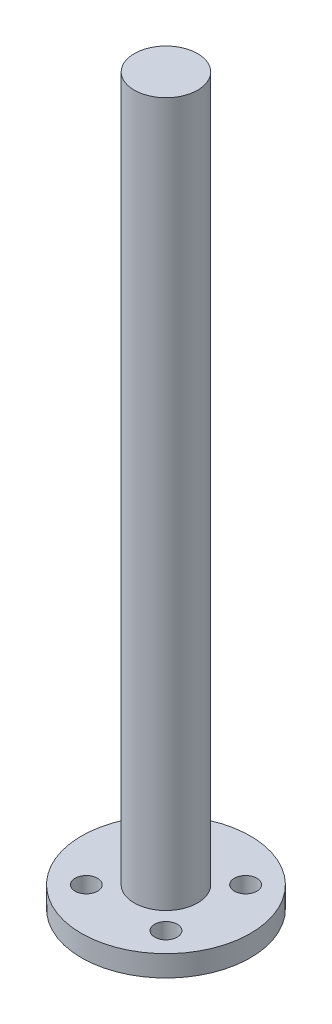
ISO-10303-21;
HEADER;
FILE_DESCRIPTION(('STEP AP214'),'2;1');
FILE_NAME('part.step','',(''),(''),'','','');
FILE_SCHEMA(('AUTOMOTIVE_DESIGN { 1 0 10303 214 1 1 1 1 }'));
ENDSEC;
DATA;
#1=APPLICATION_CONTEXT('core data for automotive mechanical design processes');
#2=APPLICATION_PROTOCOL_DEFINITION('international standard','automotive_design',2000,#1);
#3=PRODUCT_CONTEXT('',#1,'mechanical');
#4=PRODUCT('Part','Part','',(#3));
#5=PRODUCT_RELATED_PRODUCT_CATEGORY('part','',(#4));
#6=PRODUCT_DEFINITION_FORMATION('','',#4);
#7=PRODUCT_DEFINITION_CONTEXT('part definition',#1,'design');
#8=PRODUCT_DEFINITION('design','',#6,#7);
#9=PRODUCT_DEFINITION_SHAPE('','',#8);
#10=(LENGTH_UNIT() NAMED_UNIT(*) SI_UNIT(.MILLI.,.METRE.));
#11=(NAMED_UNIT(*) PLANE_ANGLE_UNIT() SI_UNIT($,.RADIAN.));
#12=(NAMED_UNIT(*) SI_UNIT($,.STERADIAN.) SOLID_ANGLE_UNIT());
#13=UNCERTAINTY_MEASURE_WITH_UNIT(LENGTH_MEASURE(1.E-05),#10,'distance_accuracy_value','');
#14=(GEOMETRIC_REPRESENTATION_CONTEXT(3) GLOBAL_UNCERTAINTY_ASSIGNED_CONTEXT((#13)) GLOBAL_UNIT_ASSIGNED_CONTEXT((#10,
#11,#12)) REPRESENTATION_CONTEXT('',''));
#15=CARTESIAN_POINT('',(0.,0.,0.));
#16=DIRECTION('',(0.,0.,1.));
#17=DIRECTION('',(1.,0.,0.));
#18=AXIS2_PLACEMENT_3D('',#15,#16,#17);
#19=CARTESIAN_POINT('',(0.,-3.,0.));
#20=DIRECTION('',(0.,1.,0.));
#21=DIRECTION('',(0.,0.,1.));
#22=AXIS2_PLACEMENT_3D('',#19,#20,#21);
#23=CYLINDRICAL_SURFACE('',#22,12.);
#24=CARTESIAN_POINT('',(0.,-3.,0.));
#25=DIRECTION('',(0.,1.,0.));
#26=DIRECTION('',(0.,0.,1.));
#27=AXIS2_PLACEMENT_3D('',#24,#25,#26);
#28=CIRCLE('',#27,12.);
#29=CARTESIAN_POINT('',(0.,-3.,12.));
#30=VERTEX_POINT('',#29);
#31=EDGE_CURVE('E10',#30,#30,#28,.T.);
#32=ORIENTED_EDGE('',*,*,#31,.T.);
#33=EDGE_LOOP('',(#32));
#34=FACE_BOUND('',#33,.T.);
#35=CARTESIAN_POINT('',(0.,0.,0.));
#36=DIRECTION('',(0.,1.,0.));
#37=DIRECTION('',(0.,0.,1.));
#38=AXIS2_PLACEMENT_3D('',#35,#36,#37);
#39=CIRCLE('',#38,12.);
#40=CARTESIAN_POINT('',(0.,0.,12.));
#41=VERTEX_POINT('',#40);
#42=EDGE_CURVE('E41',#41,#41,#39,.T.);
#43=ORIENTED_EDGE('',*,*,#42,.F.);
#44=EDGE_LOOP('',(#43));
#45=FACE_BOUND('',#44,.T.);
#46=ADVANCED_FACE('F38',(#34,#45),#23,.T.);
#47=CARTESIAN_POINT('',(0.,-3.,0.));
#48=DIRECTION('',(0.,1.,0.));
#49=DIRECTION('',(0.,0.,1.));
#50=AXIS2_PLACEMENT_3D('',#47,#48,#49);
#51=PLANE('',#50);
#52=CARTESIAN_POINT('',(5.65685424949245,-3.,-5.65685424949231));
#53=DIRECTION('',(0.,1.,0.));
#54=DIRECTION('',(0.,0.,1.));
#55=AXIS2_PLACEMENT_3D('',#52,#53,#54);
#56=CIRCLE('',#55,1.6);
#57=CARTESIAN_POINT('',(5.65685424949245,-3.,-4.05685424949231));
#58=VERTEX_POINT('',#57);
#59=EDGE_CURVE('E56',#58,#58,#56,.T.);
#60=ORIENTED_EDGE('',*,*,#59,.T.);
#61=EDGE_LOOP('',(#60));
#62=FACE_BOUND('',#61,.T.);
#63=CARTESIAN_POINT('',(-5.65685424949233,-3.,-5.65685424949243));
#64=DIRECTION('',(0.,1.,0.));
#65=DIRECTION('',(0.,0.,1.));
#66=AXIS2_PLACEMENT_3D('',#63,#64,#65);
#67=CIRCLE('',#66,1.6);
#68=CARTESIAN_POINT('',(-5.65685424949233,-3.,-4.05685424949243));
#69=VERTEX_POINT('',#68);
#70=EDGE_CURVE('E63',#69,#69,#67,.T.);
#71=ORIENTED_EDGE('',*,*,#70,.T.);
#72=EDGE_LOOP('',(#71));
#73=FACE_BOUND('',#72,.T.);
#74=CARTESIAN_POINT('',(-5.65685424949241,-3.,5.65685424949235));
#75=DIRECTION('',(0.,1.,0.));
#76=DIRECTION('',(0.,0.,1.));
#77=AXIS2_PLACEMENT_3D('',#74,#75,#76);
#78=CIRCLE('',#77,1.6);
#79=CARTESIAN_POINT('',(-5.65685424949241,-3.,7.25685424949235));
#80=VERTEX_POINT('',#79);
#81=EDGE_CURVE('E69',#80,#80,#78,.T.);
#82=ORIENTED_EDGE('',*,*,#81,.T.);
#83=EDGE_LOOP('',(#82));
#84=FACE_BOUND('',#83,.T.);
#85=CARTESIAN_POINT('',(5.65685424949237,-3.,5.65685424949239));
#86=DIRECTION('',(0.,1.,0.));
#87=DIRECTION('',(0.,0.,1.));
#88=AXIS2_PLACEMENT_3D('',#85,#86,#87);
#89=CIRCLE('',#88,1.6);
#90=CARTESIAN_POINT('',(5.65685424949237,-3.,7.25685424949239));
#91=VERTEX_POINT('',#90);
#92=EDGE_CURVE('E48',#91,#91,#89,.T.);
#93=ORIENTED_EDGE('',*,*,#92,.T.);
#94=EDGE_LOOP('',(#93));
#95=FACE_BOUND('',#94,.T.);
#96=ORIENTED_EDGE('',*,*,#31,.F.);
#97=EDGE_LOOP('',(#96));
#98=FACE_BOUND('',#97,.T.);
#99=ADVANCED_FACE('F93',(#62,#73,#84,#95,#98),#51,.F.);
#100=CARTESIAN_POINT('',(0.,0.,0.));
#101=DIRECTION('',(0.,1.,0.));
#102=DIRECTION('',(0.,0.,1.));
#103=AXIS2_PLACEMENT_3D('',#100,#101,#102);
#104=PLANE('',#103);
#105=CARTESIAN_POINT('',(0.,0.,0.));
#106=DIRECTION('',(0.,1.,0.));
#107=DIRECTION('',(0.,0.,1.));
#108=AXIS2_PLACEMENT_3D('',#105,#106,#107);
#109=CIRCLE('',#108,4.5);
#110=CARTESIAN_POINT('',(0.,0.,4.5));
#111=VERTEX_POINT('',#110);
#112=EDGE_CURVE('E74',#111,#111,#109,.T.);
#113=ORIENTED_EDGE('',*,*,#112,.F.);
#114=EDGE_LOOP('',(#113));
#115=FACE_BOUND('',#114,.T.);
#116=CARTESIAN_POINT('',(5.65685424949245,0.,-5.65685424949231));
#117=DIRECTION('',(0.,1.,0.));
#118=DIRECTION('',(0.,0.,1.));
#119=AXIS2_PLACEMENT_3D('',#116,#117,#118);
#120=CIRCLE('',#119,1.6);
#121=CARTESIAN_POINT('',(5.65685424949245,0.,-4.05685424949231));
#122=VERTEX_POINT('',#121);
#123=EDGE_CURVE('E59',#122,#122,#120,.T.);
#124=ORIENTED_EDGE('',*,*,#123,.F.);
#125=EDGE_LOOP('',(#124));
#126=FACE_BOUND('',#125,.T.);
#127=CARTESIAN_POINT('',(-5.65685424949233,0.,-5.65685424949243));
#128=DIRECTION('',(0.,1.,0.));
#129=DIRECTION('',(0.,0.,1.));
#130=AXIS2_PLACEMENT_3D('',#127,#128,#129);
#131=CIRCLE('',#130,1.6);
#132=CARTESIAN_POINT('',(-5.65685424949233,0.,-4.05685424949243));
#133=VERTEX_POINT('',#132);
#134=EDGE_CURVE('E66',#133,#133,#131,.T.);
#135=ORIENTED_EDGE('',*,*,#134,.F.);
#136=EDGE_LOOP('',(#135));
#137=FACE_BOUND('',#136,.T.);
#138=CARTESIAN_POINT('',(-5.65685424949241,0.,5.65685424949235));
#139=DIRECTION('',(0.,1.,0.));
#140=DIRECTION('',(0.,0.,1.));
#141=AXIS2_PLACEMENT_3D('',#138,#139,#140);
#142=CIRCLE('',#141,1.6);
#143=CARTESIAN_POINT('',(-5.65685424949241,0.,7.25685424949235));
#144=VERTEX_POINT('',#143);
#145=EDGE_CURVE('E53',#144,#144,#142,.T.);
#146=ORIENTED_EDGE('',*,*,#145,.F.);
#147=EDGE_LOOP('',(#146));
#148=FACE_BOUND('',#147,.T.);
#149=CARTESIAN_POINT('',(5.65685424949237,0.,5.65685424949239));
#150=DIRECTION('',(0.,1.,0.));
#151=DIRECTION('',(0.,0.,1.));
#152=AXIS2_PLACEMENT_3D('',#149,#150,#151);
#153=CIRCLE('',#152,1.6);
#154=CARTESIAN_POINT('',(5.65685424949237,0.,7.25685424949239));
#155=VERTEX_POINT('',#154);
#156=EDGE_CURVE('E50',#155,#155,#153,.T.);
#157=ORIENTED_EDGE('',*,*,#156,.F.);
#158=EDGE_LOOP('',(#157));
#159=FACE_BOUND('',#158,.T.);
#160=ORIENTED_EDGE('',*,*,#42,.T.);
#161=EDGE_LOOP('',(#160));
#162=FACE_BOUND('',#161,.T.);
#163=ADVANCED_FACE('F89',(#115,#126,#137,#148,#159,#162),#104,.T.);
#164=CARTESIAN_POINT('',(5.65685424949237,-3.,5.65685424949239));
#165=DIRECTION('',(0.,1.,0.));
#166=DIRECTION('',(0.,0.,1.));
#167=AXIS2_PLACEMENT_3D('',#164,#165,#166);
#168=CYLINDRICAL_SURFACE('',#167,1.6);
#169=ORIENTED_EDGE('',*,*,#92,.F.);
#170=EDGE_LOOP('',(#169));
#171=FACE_BOUND('',#170,.T.);
#172=ORIENTED_EDGE('',*,*,#156,.T.);
#173=EDGE_LOOP('',(#172));
#174=FACE_BOUND('',#173,.T.);
#175=ADVANCED_FACE('F92',(#171,#174),#168,.F.);
#176=CARTESIAN_POINT('',(-5.65685424949241,-3.,5.65685424949235));
#177=DIRECTION('',(0.,1.,0.));
#178=DIRECTION('',(0.,0.,1.));
#179=AXIS2_PLACEMENT_3D('',#176,#177,#178);
#180=CYLINDRICAL_SURFACE('',#179,1.6);
#181=ORIENTED_EDGE('',*,*,#81,.F.);
#182=EDGE_LOOP('',(#181));
#183=FACE_BOUND('',#182,.T.);
#184=ORIENTED_EDGE('',*,*,#145,.T.);
#185=EDGE_LOOP('',(#184));
#186=FACE_BOUND('',#185,.T.);
#187=ADVANCED_FACE('F116',(#183,#186),#180,.F.);
#188=CARTESIAN_POINT('',(-5.65685424949233,-3.,-5.65685424949243));
#189=DIRECTION('',(0.,1.,0.));
#190=DIRECTION('',(0.,0.,1.));
#191=AXIS2_PLACEMENT_3D('',#188,#189,#190);
#192=CYLINDRICAL_SURFACE('',#191,1.6);
#193=ORIENTED_EDGE('',*,*,#70,.F.);
#194=EDGE_LOOP('',(#193));
#195=FACE_BOUND('',#194,.T.);
#196=ORIENTED_EDGE('',*,*,#134,.T.);
#197=EDGE_LOOP('',(#196));
#198=FACE_BOUND('',#197,.T.);
#199=ADVANCED_FACE('F120',(#195,#198),#192,.F.);
#200=CARTESIAN_POINT('',(5.65685424949245,-3.,-5.65685424949231));
#201=DIRECTION('',(0.,1.,0.));
#202=DIRECTION('',(0.,0.,1.));
#203=AXIS2_PLACEMENT_3D('',#200,#201,#202);
#204=CYLINDRICAL_SURFACE('',#203,1.6);
#205=ORIENTED_EDGE('',*,*,#59,.F.);
#206=EDGE_LOOP('',(#205));
#207=FACE_BOUND('',#206,.T.);
#208=ORIENTED_EDGE('',*,*,#123,.T.);
#209=EDGE_LOOP('',(#208));
#210=FACE_BOUND('',#209,.T.);
#211=ADVANCED_FACE('F85',(#207,#210),#204,.F.);
#212=CARTESIAN_POINT('',(0.,100.,0.));
#213=DIRECTION('',(0.,-1.,0.));
#214=DIRECTION('',(0.,0.,-1.));
#215=AXIS2_PLACEMENT_3D('',#212,#213,#214);
#216=CYLINDRICAL_SURFACE('',#215,4.5);
#217=CARTESIAN_POINT('',(0.,100.,0.));
#218=DIRECTION('',(0.,1.,0.));
#219=DIRECTION('',(0.,0.,1.));
#220=AXIS2_PLACEMENT_3D('',#217,#218,#219);
#221=CIRCLE('',#220,4.5);
#222=CARTESIAN_POINT('',(0.,100.,4.5));
#223=VERTEX_POINT('',#222);
#224=EDGE_CURVE('E60',#223,#223,#221,.T.);
#225=ORIENTED_EDGE('',*,*,#224,.F.);
#226=EDGE_LOOP('',(#225));
#227=FACE_BOUND('',#226,.T.);
#228=ORIENTED_EDGE('',*,*,#112,.T.);
#229=EDGE_LOOP('',(#228));
#230=FACE_BOUND('',#229,.T.);
#231=ADVANCED_FACE('F82',(#227,#230),#216,.T.);
#232=CARTESIAN_POINT('',(0.,100.,0.));
#233=DIRECTION('',(0.,1.,0.));
#234=DIRECTION('',(0.,0.,1.));
#235=AXIS2_PLACEMENT_3D('',#232,#233,#234);
#236=PLANE('',#235);
#237=ORIENTED_EDGE('',*,*,#224,.T.);
#238=EDGE_LOOP('',(#237));
#239=FACE_BOUND('',#238,.T.);
#240=ADVANCED_FACE('F80',(#239),#236,.T.);
#241=CLOSED_SHELL('',(#46,#99,#163,#175,#187,#199,#211,#231,#240));
#242=MANIFOLD_SOLID_BREP('B2',#241);
#243=ADVANCED_BREP_SHAPE_REPRESENTATION('',(#18,#242),#14);
#244=SHAPE_DEFINITION_REPRESENTATION(#9,#243);
ENDSEC;
END-ISO-10303-21;
